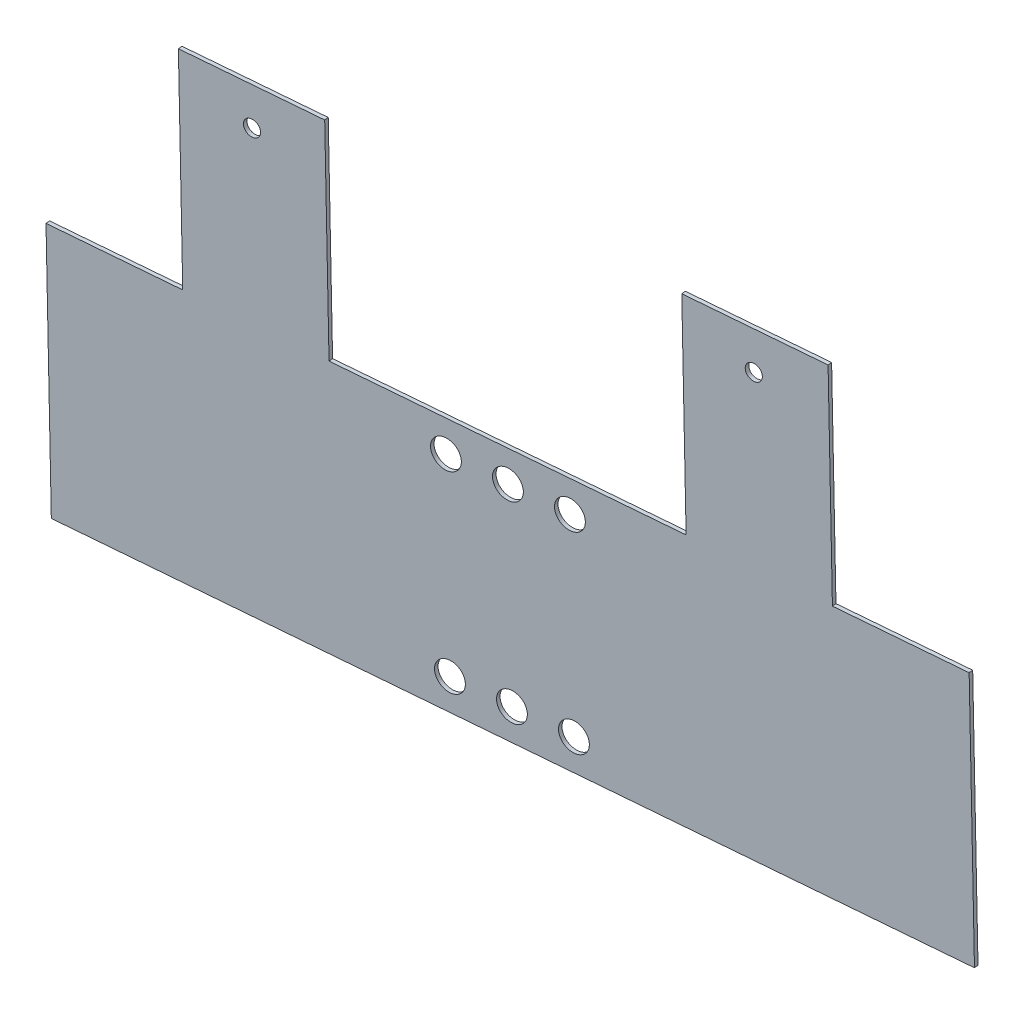
ISO-10303-21;
HEADER;
FILE_DESCRIPTION(('STEP AP214'),'2;1');
FILE_NAME('part.step','',(''),(''),'','','');
FILE_SCHEMA(('AUTOMOTIVE_DESIGN { 1 0 10303 214 1 1 1 1 }'));
ENDSEC;
DATA;
#1=APPLICATION_CONTEXT('core data for automotive mechanical design processes');
#2=APPLICATION_PROTOCOL_DEFINITION('international standard','automotive_design',2000,#1);
#3=PRODUCT_CONTEXT('',#1,'mechanical');
#4=PRODUCT('Part','Part','',(#3));
#5=PRODUCT_RELATED_PRODUCT_CATEGORY('part','',(#4));
#6=PRODUCT_DEFINITION_FORMATION('','',#4);
#7=PRODUCT_DEFINITION_CONTEXT('part definition',#1,'design');
#8=PRODUCT_DEFINITION('design','',#6,#7);
#9=PRODUCT_DEFINITION_SHAPE('','',#8);
#10=(LENGTH_UNIT() NAMED_UNIT(*) SI_UNIT(.MILLI.,.METRE.));
#11=(NAMED_UNIT(*) PLANE_ANGLE_UNIT() SI_UNIT($,.RADIAN.));
#12=(NAMED_UNIT(*) SI_UNIT($,.STERADIAN.) SOLID_ANGLE_UNIT());
#13=UNCERTAINTY_MEASURE_WITH_UNIT(LENGTH_MEASURE(1.E-05),#10,'distance_accuracy_value','');
#14=(GEOMETRIC_REPRESENTATION_CONTEXT(3) GLOBAL_UNCERTAINTY_ASSIGNED_CONTEXT((#13)) GLOBAL_UNIT_ASSIGNED_CONTEXT((#10,
#11,#12)) REPRESENTATION_CONTEXT('',''));
#15=CARTESIAN_POINT('',(0.,0.,0.));
#16=DIRECTION('',(0.,0.,1.));
#17=DIRECTION('',(1.,0.,0.));
#18=AXIS2_PLACEMENT_3D('',#15,#16,#17);
#19=CARTESIAN_POINT('',(-501.489956429642,-328.947406139133,240.499575413323));
#20=DIRECTION('',(0.99656940991837,0.00195950965151666,-0.0827379691367708));
#21=DIRECTION('',(-0.0827381279808112,0.,-0.996571323176736));
#22=AXIS2_PLACEMENT_3D('',#19,#20,#21);
#23=PLANE('',#22);
#24=DIRECTION('',(-0.00028055772663787,0.999793911631424,0.0202991515117986));
#25=VECTOR('',#24,1.);
#26=CARTESIAN_POINT('',(-501.439505510465,-328.959723900019,241.106959260261));
#27=LINE('',#26,#25);
#28=CARTESIAN_POINT('',(-501.439505510465,-328.959723900019,241.106959260261));
#29=VERTEX_POINT('',#28);
#30=CARTESIAN_POINT('',(-501.450907376476,-288.328099331318,241.9319167777));
#31=VERTEX_POINT('',#30);
#32=EDGE_CURVE('E157',#29,#31,#27,.T.);
#33=ORIENTED_EDGE('',*,*,#32,.T.);
#34=DIRECTION('',(0.082760694186997,-0.0202063006674291,0.99636457831008));
#35=VECTOR('',#34,1.);
#36=CARTESIAN_POINT('',(-501.501358295652,-288.315781570432,241.324532930762));
#37=LINE('',#36,#35);
#38=CARTESIAN_POINT('',(-501.501358295652,-288.315781570432,241.324532930762));
#39=VERTEX_POINT('',#38);
#40=EDGE_CURVE('E11',#39,#31,#37,.T.);
#41=ORIENTED_EDGE('',*,*,#40,.F.);
#42=DIRECTION('',(-0.00028055772663787,0.999793911631424,0.0202991515117986));
#43=VECTOR('',#42,1.);
#44=CARTESIAN_POINT('',(-501.489956429642,-328.947406139133,240.499575413323));
#45=LINE('',#44,#43);
#46=CARTESIAN_POINT('',(-501.489956429642,-328.947406139133,240.499575413323));
#47=VERTEX_POINT('',#46);
#48=EDGE_CURVE('E181',#47,#39,#45,.T.);
#49=ORIENTED_EDGE('',*,*,#48,.F.);
#50=DIRECTION('',(0.082760694186997,-0.0202063006674291,0.99636457831008));
#51=VECTOR('',#50,1.);
#52=CARTESIAN_POINT('',(-501.489956429642,-328.947406139133,240.499575413323));
#53=LINE('',#52,#51);
#54=EDGE_CURVE('E153',#47,#29,#53,.T.);
#55=ORIENTED_EDGE('',*,*,#54,.T.);
#56=EDGE_LOOP('',(#33,#41,#49,#55));
#57=FACE_BOUND('',#56,.T.);
#58=ADVANCED_FACE('F36',(#57),#23,.F.);
#59=CARTESIAN_POINT('',(-501.501358295652,-288.315781570432,241.324532930762));
#60=DIRECTION('',(0.000280557726639362,-0.999793911631424,-0.0202991515117987));
#61=DIRECTION('',(0.,0.0202991523106987,-0.999793950979634));
#62=AXIS2_PLACEMENT_3D('',#59,#60,#61);
#63=PLANE('',#62);
#64=DIRECTION('',(0.99656940991837,0.00195950965151815,-0.0827379691367705));
#65=VECTOR('',#64,1.);
#66=CARTESIAN_POINT('',(-501.450907376476,-288.328099331318,241.9319167777));
#67=LINE('',#66,#65);
#68=CARTESIAN_POINT('',(-481.580309912113,-288.289028668377,240.282204411082));
#69=VERTEX_POINT('',#68);
#70=EDGE_CURVE('E160',#31,#69,#67,.T.);
#71=ORIENTED_EDGE('',*,*,#70,.T.);
#72=DIRECTION('',(0.082760694186997,-0.0202063006674291,0.99636457831008));
#73=VECTOR('',#72,1.);
#74=CARTESIAN_POINT('',(-481.63076083129,-288.27671090749,239.674820564144));
#75=LINE('',#74,#73);
#76=CARTESIAN_POINT('',(-481.63076083129,-288.27671090749,239.674820564144));
#77=VERTEX_POINT('',#76);
#78=EDGE_CURVE('E44',#77,#69,#75,.T.);
#79=ORIENTED_EDGE('',*,*,#78,.F.);
#80=DIRECTION('',(0.99656940991837,0.00195950965151815,-0.0827379691367705));
#81=VECTOR('',#80,1.);
#82=CARTESIAN_POINT('',(-501.501358295652,-288.315781570432,241.324532930762));
#83=LINE('',#82,#81);
#84=EDGE_CURVE('E105',#39,#77,#83,.T.);
#85=ORIENTED_EDGE('',*,*,#84,.F.);
#86=ORIENTED_EDGE('',*,*,#40,.T.);
#87=EDGE_LOOP('',(#71,#79,#85,#86));
#88=FACE_BOUND('',#87,.T.);
#89=ADVANCED_FACE('F332',(#88),#63,.F.);
#90=CARTESIAN_POINT('',(-481.63076083129,-288.27671090749,239.674820564144));
#91=DIRECTION('',(0.99656940991837,0.00195950965151761,-0.0827379691367708));
#92=DIRECTION('',(-0.0827381279808112,0.,-0.996571323176736));
#93=AXIS2_PLACEMENT_3D('',#90,#91,#92);
#94=PLANE('',#93);
#95=DIRECTION('',(-0.000280557726638828,0.999793911631424,0.0202991515117985));
#96=VECTOR('',#95,1.);
#97=CARTESIAN_POINT('',(-481.580309912113,-288.289028668377,240.282204411082));
#98=LINE('',#97,#96);
#99=CARTESIAN_POINT('',(-481.589628158372,-255.082579541952,240.956406098194));
#100=VERTEX_POINT('',#99);
#101=EDGE_CURVE('E163',#69,#100,#98,.T.);
#102=ORIENTED_EDGE('',*,*,#101,.T.);
#103=DIRECTION('',(0.082760694186997,-0.0202063006674291,0.99636457831008));
#104=VECTOR('',#103,1.);
#105=CARTESIAN_POINT('',(-481.640079077549,-255.070261781065,240.349022251256));
#106=LINE('',#105,#104);
#107=CARTESIAN_POINT('',(-481.640079077549,-255.070261781065,240.349022251256));
#108=VERTEX_POINT('',#107);
#109=EDGE_CURVE('E200',#108,#100,#106,.T.);
#110=ORIENTED_EDGE('',*,*,#109,.F.);
#111=DIRECTION('',(-0.000280557726638828,0.999793911631424,0.0202991515117985));
#112=VECTOR('',#111,1.);
#113=CARTESIAN_POINT('',(-481.63076083129,-288.27671090749,239.674820564144));
#114=LINE('',#113,#112);
#115=EDGE_CURVE('E208',#77,#108,#114,.T.);
#116=ORIENTED_EDGE('',*,*,#115,.F.);
#117=ORIENTED_EDGE('',*,*,#78,.T.);
#118=EDGE_LOOP('',(#102,#110,#116,#117));
#119=FACE_BOUND('',#118,.T.);
#120=ADVANCED_FACE('F206',(#119),#94,.F.);
#121=CARTESIAN_POINT('',(-481.640079077549,-255.070261781065,240.349022251256));
#122=DIRECTION('',(0.000280557726637702,-0.999793911631424,-0.0202991515117986));
#123=DIRECTION('',(0.,0.0202991523106985,-0.999793950979634));
#124=AXIS2_PLACEMENT_3D('',#121,#122,#123);
#125=PLANE('',#124);
#126=DIRECTION('',(0.99656940991837,0.00195950965151649,-0.0827379691367709));
#127=VECTOR('',#126,1.);
#128=CARTESIAN_POINT('',(-481.589628158372,-255.082579541952,240.956406098194));
#129=LINE('',#128,#127);
#130=CARTESIAN_POINT('',(-460.326823228354,-255.040771444027,239.191108788692));
#131=VERTEX_POINT('',#130);
#132=EDGE_CURVE('E165',#100,#131,#129,.T.);
#133=ORIENTED_EDGE('',*,*,#132,.T.);
#134=DIRECTION('',(0.082760694186997,-0.0202063006674291,0.99636457831008));
#135=VECTOR('',#134,1.);
#136=CARTESIAN_POINT('',(-460.37727414753,-255.028453683141,238.583724941754));
#137=LINE('',#136,#135);
#138=CARTESIAN_POINT('',(-460.37727414753,-255.028453683141,238.583724941754));
#139=VERTEX_POINT('',#138);
#140=EDGE_CURVE('E197',#139,#131,#137,.T.);
#141=ORIENTED_EDGE('',*,*,#140,.F.);
#142=DIRECTION('',(0.99656940991837,0.00195950965151649,-0.0827379691367709));
#143=VECTOR('',#142,1.);
#144=CARTESIAN_POINT('',(-481.640079077549,-255.070261781065,240.349022251256));
#145=LINE('',#144,#143);
#146=EDGE_CURVE('E224',#108,#139,#145,.T.);
#147=ORIENTED_EDGE('',*,*,#146,.F.);
#148=ORIENTED_EDGE('',*,*,#109,.T.);
#149=EDGE_LOOP('',(#133,#141,#147,#148));
#150=FACE_BOUND('',#149,.T.);
#151=ADVANCED_FACE('F215',(#150),#125,.F.);
#152=CARTESIAN_POINT('',(-460.367955901271,-288.234902809565,237.909523254642));
#153=DIRECTION('',(-0.99656940991837,-0.00195950965151761,0.0827379691367708));
#154=DIRECTION('',(0.0827381279808112,0.,0.996571323176736));
#155=AXIS2_PLACEMENT_3D('',#152,#153,#154);
#156=PLANE('',#155);
#157=DIRECTION('',(0.000280557726638828,-0.999793911631424,-0.0202991515117985));
#158=VECTOR('',#157,1.);
#159=CARTESIAN_POINT('',(-460.317504982095,-288.247220570452,238.51690710158));
#160=LINE('',#159,#158);
#161=CARTESIAN_POINT('',(-460.317504982095,-288.247220570452,238.51690710158));
#162=VERTEX_POINT('',#161);
#163=EDGE_CURVE('E167',#131,#162,#160,.T.);
#164=ORIENTED_EDGE('',*,*,#163,.T.);
#165=DIRECTION('',(0.082760694186997,-0.0202063006674291,0.99636457831008));
#166=VECTOR('',#165,1.);
#167=CARTESIAN_POINT('',(-460.367955901271,-288.234902809565,237.909523254642));
#168=LINE('',#167,#166);
#169=CARTESIAN_POINT('',(-460.367955901271,-288.234902809565,237.909523254642));
#170=VERTEX_POINT('',#169);
#171=EDGE_CURVE('E194',#170,#162,#168,.T.);
#172=ORIENTED_EDGE('',*,*,#171,.F.);
#173=DIRECTION('',(0.000280557726638828,-0.999793911631424,-0.0202991515117985));
#174=VECTOR('',#173,1.);
#175=CARTESIAN_POINT('',(-460.367955901271,-288.234902809565,237.909523254642));
#176=LINE('',#175,#174);
#177=EDGE_CURVE('E221',#139,#170,#176,.T.);
#178=ORIENTED_EDGE('',*,*,#177,.F.);
#179=ORIENTED_EDGE('',*,*,#140,.T.);
#180=EDGE_LOOP('',(#164,#172,#178,#179));
#181=FACE_BOUND('',#180,.T.);
#182=ADVANCED_FACE('F219',(#181),#156,.F.);
#183=CARTESIAN_POINT('',(-460.367955901271,-288.234902809565,237.909523254642));
#184=DIRECTION('',(0.000280557726638659,-0.999793911631424,-0.0202991515117987));
#185=DIRECTION('',(0.,0.0202991523106986,-0.999793950979634));
#186=AXIS2_PLACEMENT_3D('',#183,#184,#185);
#187=PLANE('',#186);
#188=DIRECTION('',(0.99656940991837,0.00195950965151746,-0.0827379691367711));
#189=VECTOR('',#188,1.);
#190=CARTESIAN_POINT('',(-460.317504982095,-288.247220570452,238.51690710158));
#191=LINE('',#190,#189);
#192=CARTESIAN_POINT('',(-408.426135807645,-288.145188902897,234.208741048628));
#193=VERTEX_POINT('',#192);
#194=EDGE_CURVE('E169',#162,#193,#191,.T.);
#195=ORIENTED_EDGE('',*,*,#194,.T.);
#196=DIRECTION('',(0.082760694186997,-0.0202063006674291,0.99636457831008));
#197=VECTOR('',#196,1.);
#198=CARTESIAN_POINT('',(-408.476586726822,-288.132871142011,233.60135720169));
#199=LINE('',#198,#197);
#200=CARTESIAN_POINT('',(-408.476586726822,-288.132871142011,233.60135720169));
#201=VERTEX_POINT('',#200);
#202=EDGE_CURVE('E191',#201,#193,#199,.T.);
#203=ORIENTED_EDGE('',*,*,#202,.F.);
#204=DIRECTION('',(0.99656940991837,0.00195950965151746,-0.0827379691367711));
#205=VECTOR('',#204,1.);
#206=CARTESIAN_POINT('',(-460.367955901271,-288.234902809565,237.909523254642));
#207=LINE('',#206,#205);
#208=EDGE_CURVE('E223',#170,#201,#207,.T.);
#209=ORIENTED_EDGE('',*,*,#208,.F.);
#210=ORIENTED_EDGE('',*,*,#171,.T.);
#211=EDGE_LOOP('',(#195,#203,#209,#210));
#212=FACE_BOUND('',#211,.T.);
#213=ADVANCED_FACE('F345',(#212),#187,.F.);
#214=CARTESIAN_POINT('',(-408.476586726822,-288.132871142011,233.60135720169));
#215=DIRECTION('',(0.99656940991837,0.00195950965151767,-0.0827379691367708));
#216=DIRECTION('',(-0.0827381279808112,0.,-0.996571323176736));
#217=AXIS2_PLACEMENT_3D('',#214,#215,#216);
#218=PLANE('',#217);
#219=DIRECTION('',(-0.000280557726638828,0.999793911631424,0.0202991515117993));
#220=VECTOR('',#219,1.);
#221=CARTESIAN_POINT('',(-408.426135807645,-288.145188902897,234.208741048628));
#222=LINE('',#221,#220);
#223=CARTESIAN_POINT('',(-408.435454053904,-254.938739776473,234.88294273574));
#224=VERTEX_POINT('',#223);
#225=EDGE_CURVE('E171',#193,#224,#222,.T.);
#226=ORIENTED_EDGE('',*,*,#225,.T.);
#227=DIRECTION('',(0.082760694186997,-0.0202063006674291,0.99636457831008));
#228=VECTOR('',#227,1.);
#229=CARTESIAN_POINT('',(-408.485904973081,-254.926422015586,234.275558888802));
#230=LINE('',#229,#228);
#231=CARTESIAN_POINT('',(-408.485904973081,-254.926422015586,234.275558888802));
#232=VERTEX_POINT('',#231);
#233=EDGE_CURVE('E188',#232,#224,#230,.T.);
#234=ORIENTED_EDGE('',*,*,#233,.F.);
#235=DIRECTION('',(-0.000280557726638828,0.999793911631424,0.0202991515117993));
#236=VECTOR('',#235,1.);
#237=CARTESIAN_POINT('',(-408.476586726822,-288.132871142011,233.60135720169));
#238=LINE('',#237,#236);
#239=EDGE_CURVE('E226',#201,#232,#238,.T.);
#240=ORIENTED_EDGE('',*,*,#239,.F.);
#241=ORIENTED_EDGE('',*,*,#202,.T.);
#242=EDGE_LOOP('',(#226,#234,#240,#241));
#243=FACE_BOUND('',#242,.T.);
#244=ADVANCED_FACE('F348',(#243),#218,.F.);
#245=CARTESIAN_POINT('',(-408.485904973081,-254.926422015586,234.275558888802));
#246=DIRECTION('',(0.000280557726637702,-0.999793911631424,-0.0202991515117986));
#247=DIRECTION('',(0.,0.0202991523106985,-0.999793950979634));
#248=AXIS2_PLACEMENT_3D('',#245,#246,#247);
#249=PLANE('',#248);
#250=DIRECTION('',(0.99656940991837,0.00195950965151649,-0.0827379691367709));
#251=VECTOR('',#250,1.);
#252=CARTESIAN_POINT('',(-408.435454053904,-254.938739776473,234.88294273574));
#253=LINE('',#252,#251);
#254=CARTESIAN_POINT('',(-387.172649123886,-254.896931678548,233.117645426238));
#255=VERTEX_POINT('',#254);
#256=EDGE_CURVE('E173',#224,#255,#253,.T.);
#257=ORIENTED_EDGE('',*,*,#256,.T.);
#258=DIRECTION('',(0.082760694186997,-0.0202063006674291,0.99636457831008));
#259=VECTOR('',#258,1.);
#260=CARTESIAN_POINT('',(-387.223100043062,-254.884613917661,232.5102615793));
#261=LINE('',#260,#259);
#262=CARTESIAN_POINT('',(-387.223100043062,-254.884613917661,232.5102615793));
#263=VERTEX_POINT('',#262);
#264=EDGE_CURVE('E185',#263,#255,#261,.T.);
#265=ORIENTED_EDGE('',*,*,#264,.F.);
#266=DIRECTION('',(0.99656940991837,0.00195950965151649,-0.0827379691367709));
#267=VECTOR('',#266,1.);
#268=CARTESIAN_POINT('',(-408.485904973081,-254.926422015586,234.275558888802));
#269=LINE('',#268,#267);
#270=EDGE_CURVE('E232',#232,#263,#269,.T.);
#271=ORIENTED_EDGE('',*,*,#270,.F.);
#272=ORIENTED_EDGE('',*,*,#233,.T.);
#273=EDGE_LOOP('',(#257,#265,#271,#272));
#274=FACE_BOUND('',#273,.T.);
#275=ADVANCED_FACE('F238',(#274),#249,.F.);
#276=CARTESIAN_POINT('',(-387.213781796803,-288.091063044086,231.836059892188));
#277=DIRECTION('',(-0.99656940991837,-0.00195950965151761,0.0827379691367708));
#278=DIRECTION('',(0.0827381279808112,0.,0.996571323176736));
#279=AXIS2_PLACEMENT_3D('',#276,#277,#278);
#280=PLANE('',#279);
#281=DIRECTION('',(0.000280557726638828,-0.999793911631424,-0.0202991515117985));
#282=VECTOR('',#281,1.);
#283=CARTESIAN_POINT('',(-387.163330877627,-288.103380804973,232.443443739126));
#284=LINE('',#283,#282);
#285=CARTESIAN_POINT('',(-387.163330877627,-288.103380804973,232.443443739126));
#286=VERTEX_POINT('',#285);
#287=EDGE_CURVE('E175',#255,#286,#284,.T.);
#288=ORIENTED_EDGE('',*,*,#287,.T.);
#289=DIRECTION('',(0.082760694186997,-0.0202063006674291,0.99636457831008));
#290=VECTOR('',#289,1.);
#291=CARTESIAN_POINT('',(-387.213781796803,-288.091063044086,231.836059892188));
#292=LINE('',#291,#290);
#293=CARTESIAN_POINT('',(-387.213781796803,-288.091063044086,231.836059892188));
#294=VERTEX_POINT('',#293);
#295=EDGE_CURVE('E148',#294,#286,#292,.T.);
#296=ORIENTED_EDGE('',*,*,#295,.F.);
#297=DIRECTION('',(0.000280557726638828,-0.999793911631424,-0.0202991515117985));
#298=VECTOR('',#297,1.);
#299=CARTESIAN_POINT('',(-387.213781796803,-288.091063044086,231.836059892188));
#300=LINE('',#299,#298);
#301=EDGE_CURVE('E137',#263,#294,#300,.T.);
#302=ORIENTED_EDGE('',*,*,#301,.F.);
#303=ORIENTED_EDGE('',*,*,#264,.T.);
#304=EDGE_LOOP('',(#288,#296,#302,#303));
#305=FACE_BOUND('',#304,.T.);
#306=ADVANCED_FACE('F242',(#305),#280,.F.);
#307=CARTESIAN_POINT('',(-387.213781796803,-288.091063044086,231.836059892188));
#308=DIRECTION('',(0.000280557726639362,-0.999793911631424,-0.0202991515117987));
#309=DIRECTION('',(0.,0.0202991523106987,-0.999793950979634));
#310=AXIS2_PLACEMENT_3D('',#307,#308,#309);
#311=PLANE('',#310);
#312=DIRECTION('',(0.99656940991837,0.00195950965151815,-0.0827379691367705));
#313=VECTOR('',#312,1.);
#314=CARTESIAN_POINT('',(-387.163330877627,-288.103380804973,232.443443739126));
#315=LINE('',#314,#313);
#316=CARTESIAN_POINT('',(-367.292733413265,-288.064310142031,230.793731372508));
#317=VERTEX_POINT('',#316);
#318=EDGE_CURVE('E146',#286,#317,#315,.T.);
#319=ORIENTED_EDGE('',*,*,#318,.T.);
#320=DIRECTION('',(0.082760694186997,-0.0202063006674291,0.99636457831008));
#321=VECTOR('',#320,1.);
#322=CARTESIAN_POINT('',(-367.343184332441,-288.051992381144,230.18634752557));
#323=LINE('',#322,#321);
#324=CARTESIAN_POINT('',(-367.343184332441,-288.051992381144,230.18634752557));
#325=VERTEX_POINT('',#324);
#326=EDGE_CURVE('E143',#325,#317,#323,.T.);
#327=ORIENTED_EDGE('',*,*,#326,.F.);
#328=DIRECTION('',(0.99656940991837,0.00195950965151815,-0.0827379691367705));
#329=VECTOR('',#328,1.);
#330=CARTESIAN_POINT('',(-387.213781796803,-288.091063044086,231.836059892188));
#331=LINE('',#330,#329);
#332=EDGE_CURVE('E130',#294,#325,#331,.T.);
#333=ORIENTED_EDGE('',*,*,#332,.F.);
#334=ORIENTED_EDGE('',*,*,#295,.T.);
#335=EDGE_LOOP('',(#319,#327,#333,#334));
#336=FACE_BOUND('',#335,.T.);
#337=ADVANCED_FACE('F144',(#336),#311,.F.);
#338=CARTESIAN_POINT('',(-367.331782466431,-328.683616949845,229.361390008131));
#339=DIRECTION('',(-0.99656940991837,-0.00195950965151394,0.0827379691367708));
#340=DIRECTION('',(0.0827381279808113,0.,0.996571323176736));
#341=AXIS2_PLACEMENT_3D('',#338,#339,#340);
#342=PLANE('',#341);
#343=DIRECTION('',(0.000280557726635138,-0.999793911631424,-0.0202991515117986));
#344=VECTOR('',#343,1.);
#345=CARTESIAN_POINT('',(-367.281331547254,-328.695934710732,229.968773855068));
#346=LINE('',#345,#344);
#347=CARTESIAN_POINT('',(-367.281331547254,-328.695934710732,229.968773855068));
#348=VERTEX_POINT('',#347);
#349=EDGE_CURVE('E178',#317,#348,#346,.T.);
#350=ORIENTED_EDGE('',*,*,#349,.T.);
#351=DIRECTION('',(0.082760694186997,-0.0202063006674291,0.99636457831008));
#352=VECTOR('',#351,1.);
#353=CARTESIAN_POINT('',(-367.331782466431,-328.683616949845,229.361390008131));
#354=LINE('',#353,#352);
#355=CARTESIAN_POINT('',(-367.331782466431,-328.683616949845,229.361390008131));
#356=VERTEX_POINT('',#355);
#357=EDGE_CURVE('E149',#356,#348,#354,.T.);
#358=ORIENTED_EDGE('',*,*,#357,.F.);
#359=DIRECTION('',(0.000280557726635138,-0.999793911631424,-0.0202991515117986));
#360=VECTOR('',#359,1.);
#361=CARTESIAN_POINT('',(-367.331782466431,-328.683616949845,229.361390008131));
#362=LINE('',#361,#360);
#363=EDGE_CURVE('E134',#325,#356,#362,.T.);
#364=ORIENTED_EDGE('',*,*,#363,.F.);
#365=ORIENTED_EDGE('',*,*,#326,.T.);
#366=EDGE_LOOP('',(#350,#358,#364,#365));
#367=FACE_BOUND('',#366,.T.);
#368=ADVANCED_FACE('F151',(#367),#342,.F.);
#369=CARTESIAN_POINT('',(-501.489956429642,-328.947406139133,240.499575413323));
#370=DIRECTION('',(-0.000280557726639362,0.999793911631424,0.0202991515117987));
#371=DIRECTION('',(0.,-0.0202991523106987,0.999793950979634));
#372=AXIS2_PLACEMENT_3D('',#369,#370,#371);
#373=PLANE('',#372);
#374=DIRECTION('',(-0.99656940991837,-0.00195950965151815,0.0827379691367705));
#375=VECTOR('',#374,1.);
#376=CARTESIAN_POINT('',(-501.439505510465,-328.959723900019,241.106959260261));
#377=LINE('',#376,#375);
#378=EDGE_CURVE('E93',#348,#29,#377,.T.);
#379=ORIENTED_EDGE('',*,*,#378,.T.);
#380=ORIENTED_EDGE('',*,*,#54,.F.);
#381=DIRECTION('',(-0.99656940991837,-0.00195950965151794,0.0827379691367709));
#382=VECTOR('',#381,1.);
#383=CARTESIAN_POINT('',(-386.587283527019,-328.721478176367,230.960035357474));
#384=LINE('',#383,#382);
#385=EDGE_CURVE('E52',#356,#47,#384,.T.);
#386=ORIENTED_EDGE('',*,*,#385,.F.);
#387=ORIENTED_EDGE('',*,*,#357,.T.);
#388=EDGE_LOOP('',(#379,#380,#386,#387));
#389=FACE_BOUND('',#388,.T.);
#390=ADVANCED_FACE('F243',(#389),#373,.F.);
#391=CARTESIAN_POINT('',(16.9467758676456,-4.13761208613666,204.023991786853));
#392=DIRECTION('',(-0.0827606941869968,0.0202063006674291,-0.99636457831008));
#393=DIRECTION('',(-0.996568045750024,0.,0.0827775947341869));
#394=AXIS2_PLACEMENT_3D('',#391,#392,#393);
#395=PLANE('',#394);
#396=CARTESIAN_POINT('',(-471.054813760999,-261.10108861582,239.347476604441));
#397=DIRECTION('',(-0.0827606941869969,0.0202063006674291,-0.99636457831008));
#398=DIRECTION('',(-0.996568045750024,0.,0.0827775947341869));
#399=AXIS2_PLACEMENT_3D('',#396,#397,#398);
#400=CIRCLE('',#399,1.25000000000001);
#401=CARTESIAN_POINT('',(-472.300523818187,-261.10108861582,239.450948597859));
#402=VERTEX_POINT('',#401);
#403=EDGE_CURVE('E294',#402,#402,#400,.T.);
#404=ORIENTED_EDGE('',*,*,#403,.F.);
#405=EDGE_LOOP('',(#404));
#406=FACE_BOUND('',#405,.T.);
#407=CARTESIAN_POINT('',(-398.13117772993,-260.957702145591,233.293153155214));
#408=DIRECTION('',(-0.0827606941869968,0.0202063006674291,-0.99636457831008));
#409=DIRECTION('',(-0.996568045750024,0.,0.0827775947341869));
#410=AXIS2_PLACEMENT_3D('',#407,#408,#409);
#411=CIRCLE('',#410,1.24999999999994);
#412=CARTESIAN_POINT('',(-399.376887787118,-260.957702145591,233.396625148631));
#413=VERTEX_POINT('',#412);
#414=EDGE_CURVE('E288',#413,#413,#411,.T.);
#415=ORIENTED_EDGE('',*,*,#414,.F.);
#416=EDGE_LOOP('',(#415));
#417=FACE_BOUND('',#416,.T.);
#418=CARTESIAN_POINT('',(-443.473097110312,-293.200655525,236.40548570979));
#419=DIRECTION('',(0.0827606941869969,-0.0202063006674292,0.99636457831008));
#420=DIRECTION('',(-0.996566946014347,-0.00391901177606996,0.0826980257221201));
#421=AXIS2_PLACEMENT_3D('',#418,#419,#420);
#422=CIRCLE('',#421,2.24999999999997);
#423=CARTESIAN_POINT('',(-445.715372738845,-293.209473301496,236.591556267665));
#424=VERTEX_POINT('',#423);
#425=EDGE_CURVE('E279',#424,#424,#422,.T.);
#426=ORIENTED_EDGE('',*,*,#425,.T.);
#427=EDGE_LOOP('',(#426));
#428=FACE_BOUND('',#427,.T.);
#429=CARTESIAN_POINT('',(-434.464565062866,-293.182942453393,235.657572278879));
#430=DIRECTION('',(0.0827606941869969,-0.0202063006674292,0.99636457831008));
#431=DIRECTION('',(-0.996566946014347,-0.00391901177606996,0.0826980257221201));
#432=AXIS2_PLACEMENT_3D('',#429,#430,#431);
#433=CIRCLE('',#432,2.24999999999995);
#434=CARTESIAN_POINT('',(-436.706840691398,-293.191760229889,235.843642836754));
#435=VERTEX_POINT('',#434);
#436=EDGE_CURVE('E271',#435,#435,#433,.T.);
#437=ORIENTED_EDGE('',*,*,#436,.T.);
#438=EDGE_LOOP('',(#437));
#439=FACE_BOUND('',#438,.T.);
#440=CARTESIAN_POINT('',(-425.456033015419,-293.165229381785,234.909658847968));
#441=DIRECTION('',(0.0827606941869969,-0.0202063006674292,0.99636457831008));
#442=DIRECTION('',(-0.996566946014347,-0.00391901177606996,0.0826980257221201));
#443=AXIS2_PLACEMENT_3D('',#440,#441,#442);
#444=CIRCLE('',#443,2.24999999999995);
#445=CARTESIAN_POINT('',(-427.698308643951,-293.174047158281,235.095729405843));
#446=VERTEX_POINT('',#445);
#447=EDGE_CURVE('E272',#446,#446,#444,.T.);
#448=ORIENTED_EDGE('',*,*,#447,.T.);
#449=EDGE_LOOP('',(#448));
#450=FACE_BOUND('',#449,.T.);
#451=CARTESIAN_POINT('',(-443.464500821569,-323.834340975916,235.783519707498));
#452=DIRECTION('',(-0.0827606941869969,0.0202063006674291,-0.99636457831008));
#453=DIRECTION('',(-0.996568045750024,0.,0.0827775947341869));
#454=AXIS2_PLACEMENT_3D('',#451,#452,#453);
#455=CIRCLE('',#454,2.24999999999997);
#456=CARTESIAN_POINT('',(-445.706778924506,-323.834340975916,235.96976929565));
#457=VERTEX_POINT('',#456);
#458=EDGE_CURVE('E261',#457,#457,#455,.T.);
#459=ORIENTED_EDGE('',*,*,#458,.F.);
#460=EDGE_LOOP('',(#459));
#461=FACE_BOUND('',#460,.T.);
#462=CARTESIAN_POINT('',(-434.455968774122,-323.816627903961,235.035606276595));
#463=DIRECTION('',(-0.0827606941869969,0.0202063006674291,-0.99636457831008));
#464=DIRECTION('',(-0.996568045750024,0.,0.0827775947341869));
#465=AXIS2_PLACEMENT_3D('',#462,#463,#464);
#466=CIRCLE('',#465,2.24999999999995);
#467=CARTESIAN_POINT('',(-436.69824687706,-323.816627903961,235.221855864746));
#468=VERTEX_POINT('',#467);
#469=EDGE_CURVE('E253',#468,#468,#466,.T.);
#470=ORIENTED_EDGE('',*,*,#469,.F.);
#471=EDGE_LOOP('',(#470));
#472=FACE_BOUND('',#471,.T.);
#473=CARTESIAN_POINT('',(-425.447436726675,-323.798914832006,234.287692845691));
#474=DIRECTION('',(-0.0827606941869969,0.0202063006674291,-0.99636457831008));
#475=DIRECTION('',(-0.996568045750024,0.,0.0827775947341869));
#476=AXIS2_PLACEMENT_3D('',#473,#474,#475);
#477=CIRCLE('',#476,2.24999999999995);
#478=CARTESIAN_POINT('',(-427.689714829613,-323.798914832006,234.473942433843));
#479=VERTEX_POINT('',#478);
#480=EDGE_CURVE('E254',#479,#479,#477,.T.);
#481=ORIENTED_EDGE('',*,*,#480,.F.);
#482=EDGE_LOOP('',(#481));
#483=FACE_BOUND('',#482,.T.);
#484=ORIENTED_EDGE('',*,*,#48,.T.);
#485=ORIENTED_EDGE('',*,*,#84,.T.);
#486=ORIENTED_EDGE('',*,*,#115,.T.);
#487=ORIENTED_EDGE('',*,*,#146,.T.);
#488=ORIENTED_EDGE('',*,*,#177,.T.);
#489=ORIENTED_EDGE('',*,*,#208,.T.);
#490=ORIENTED_EDGE('',*,*,#239,.T.);
#491=ORIENTED_EDGE('',*,*,#270,.T.);
#492=ORIENTED_EDGE('',*,*,#301,.T.);
#493=ORIENTED_EDGE('',*,*,#332,.T.);
#494=ORIENTED_EDGE('',*,*,#363,.T.);
#495=ORIENTED_EDGE('',*,*,#385,.T.);
#496=EDGE_LOOP('',(#484,#485,#486,#487,#488,#489,#490,#491,#492,#493,#494,#495));
#497=FACE_BOUND('',#496,.T.);
#498=ADVANCED_FACE('F132',(#406,#417,#428,#439,#450,#461,#472,#483,#497),#395,.T.);
#499=CARTESIAN_POINT('',(16.997226786822,-4.14992984702352,204.631375633791));
#500=DIRECTION('',(-0.0827606941869968,0.0202063006674291,-0.99636457831008));
#501=DIRECTION('',(-0.996568045750024,0.,0.0827775947341869));
#502=AXIS2_PLACEMENT_3D('',#499,#500,#501);
#503=PLANE('',#502);
#504=CARTESIAN_POINT('',(-471.004362841823,-261.113406376707,239.954860451379));
#505=DIRECTION('',(-0.0827606941869968,0.0202063006674291,-0.99636457831008));
#506=DIRECTION('',(-0.996568045750024,0.,0.0827775947341869));
#507=AXIS2_PLACEMENT_3D('',#504,#505,#506);
#508=CIRCLE('',#507,1.25000000000001);
#509=CARTESIAN_POINT('',(-472.25007289901,-261.113406376707,240.058332444796));
#510=VERTEX_POINT('',#509);
#511=EDGE_CURVE('E291',#510,#510,#508,.F.);
#512=ORIENTED_EDGE('',*,*,#511,.F.);
#513=EDGE_LOOP('',(#512));
#514=FACE_BOUND('',#513,.T.);
#515=CARTESIAN_POINT('',(-398.080726810754,-260.970019906477,233.900537002151));
#516=DIRECTION('',(-0.0827606941869968,0.0202063006674291,-0.99636457831008));
#517=DIRECTION('',(-0.996568045750024,0.,0.0827775947341869));
#518=AXIS2_PLACEMENT_3D('',#515,#516,#517);
#519=CIRCLE('',#518,1.24999999999994);
#520=CARTESIAN_POINT('',(-399.326436867941,-260.970019906477,234.004008995569));
#521=VERTEX_POINT('',#520);
#522=EDGE_CURVE('E275',#521,#521,#519,.F.);
#523=ORIENTED_EDGE('',*,*,#522,.F.);
#524=EDGE_LOOP('',(#523));
#525=FACE_BOUND('',#524,.T.);
#526=CARTESIAN_POINT('',(-443.422646191136,-293.212973285887,237.012869556728));
#527=DIRECTION('',(-0.0827606941869968,0.0202063006674291,-0.99636457831008));
#528=DIRECTION('',(-0.996568045750024,0.,0.0827775947341869));
#529=AXIS2_PLACEMENT_3D('',#526,#527,#528);
#530=CIRCLE('',#529,2.24999999999997);
#531=CARTESIAN_POINT('',(-445.664924294074,-293.212973285887,237.19911914488));
#532=VERTEX_POINT('',#531);
#533=EDGE_CURVE('E257',#532,#532,#530,.T.);
#534=ORIENTED_EDGE('',*,*,#533,.T.);
#535=EDGE_LOOP('',(#534));
#536=FACE_BOUND('',#535,.T.);
#537=CARTESIAN_POINT('',(-434.414114143689,-293.19526021428,236.264956125817));
#538=DIRECTION('',(-0.0827606941869968,0.0202063006674291,-0.99636457831008));
#539=DIRECTION('',(-0.996568045750024,0.,0.0827775947341869));
#540=AXIS2_PLACEMENT_3D('',#537,#538,#539);
#541=CIRCLE('',#540,2.24999999999995);
#542=CARTESIAN_POINT('',(-436.656392246627,-293.19526021428,236.451205713969));
#543=VERTEX_POINT('',#542);
#544=EDGE_CURVE('E276',#543,#543,#541,.T.);
#545=ORIENTED_EDGE('',*,*,#544,.T.);
#546=EDGE_LOOP('',(#545));
#547=FACE_BOUND('',#546,.T.);
#548=CARTESIAN_POINT('',(-425.405582096243,-293.177547142672,235.517042694906));
#549=DIRECTION('',(-0.0827606941869968,0.0202063006674291,-0.99636457831008));
#550=DIRECTION('',(-0.996568045750024,0.,0.0827775947341869));
#551=AXIS2_PLACEMENT_3D('',#548,#549,#550);
#552=CIRCLE('',#551,2.24999999999995);
#553=CARTESIAN_POINT('',(-427.64786019918,-293.177547142672,235.703292283058));
#554=VERTEX_POINT('',#553);
#555=EDGE_CURVE('E268',#554,#554,#552,.T.);
#556=ORIENTED_EDGE('',*,*,#555,.T.);
#557=EDGE_LOOP('',(#556));
#558=FACE_BOUND('',#557,.T.);
#559=CARTESIAN_POINT('',(-443.414049902392,-323.846658736803,236.390903554436));
#560=DIRECTION('',(-0.0827606941869968,0.0202063006674291,-0.99636457831008));
#561=DIRECTION('',(-0.996568045750024,0.,0.0827775947341869));
#562=AXIS2_PLACEMENT_3D('',#559,#560,#561);
#563=CIRCLE('',#562,2.24999999999997);
#564=CARTESIAN_POINT('',(-445.65632800533,-323.846658736803,236.577153142588));
#565=VERTEX_POINT('',#564);
#566=EDGE_CURVE('E161',#565,#565,#563,.F.);
#567=ORIENTED_EDGE('',*,*,#566,.F.);
#568=EDGE_LOOP('',(#567));
#569=FACE_BOUND('',#568,.T.);
#570=CARTESIAN_POINT('',(-434.405517854946,-323.828945664848,235.642990123532));
#571=DIRECTION('',(-0.0827606941869968,0.0202063006674291,-0.99636457831008));
#572=DIRECTION('',(-0.996568045750024,0.,0.0827775947341869));
#573=AXIS2_PLACEMENT_3D('',#570,#571,#572);
#574=CIRCLE('',#573,2.24999999999995);
#575=CARTESIAN_POINT('',(-436.647795957883,-323.828945664848,235.829239711684));
#576=VERTEX_POINT('',#575);
#577=EDGE_CURVE('E258',#576,#576,#574,.F.);
#578=ORIENTED_EDGE('',*,*,#577,.F.);
#579=EDGE_LOOP('',(#578));
#580=FACE_BOUND('',#579,.T.);
#581=CARTESIAN_POINT('',(-425.396985807499,-323.811232592893,234.895076692629));
#582=DIRECTION('',(-0.0827606941869968,0.0202063006674291,-0.99636457831008));
#583=DIRECTION('',(-0.996568045750024,0.,0.0827775947341869));
#584=AXIS2_PLACEMENT_3D('',#581,#582,#583);
#585=CIRCLE('',#584,2.24999999999995);
#586=CARTESIAN_POINT('',(-427.639263910437,-323.811232592893,235.08132628078));
#587=VERTEX_POINT('',#586);
#588=EDGE_CURVE('E250',#587,#587,#585,.F.);
#589=ORIENTED_EDGE('',*,*,#588,.F.);
#590=EDGE_LOOP('',(#589));
#591=FACE_BOUND('',#590,.T.);
#592=ORIENTED_EDGE('',*,*,#32,.F.);
#593=ORIENTED_EDGE('',*,*,#378,.F.);
#594=ORIENTED_EDGE('',*,*,#349,.F.);
#595=ORIENTED_EDGE('',*,*,#318,.F.);
#596=ORIENTED_EDGE('',*,*,#287,.F.);
#597=ORIENTED_EDGE('',*,*,#256,.F.);
#598=ORIENTED_EDGE('',*,*,#225,.F.);
#599=ORIENTED_EDGE('',*,*,#194,.F.);
#600=ORIENTED_EDGE('',*,*,#163,.F.);
#601=ORIENTED_EDGE('',*,*,#132,.F.);
#602=ORIENTED_EDGE('',*,*,#101,.F.);
#603=ORIENTED_EDGE('',*,*,#70,.F.);
#604=EDGE_LOOP('',(#592,#593,#594,#595,#596,#597,#598,#599,#600,#601,#602,#603));
#605=FACE_BOUND('',#604,.T.);
#606=ADVANCED_FACE('F210',(#514,#525,#536,#547,#558,#569,#580,#591,#605),#503,.F.);
#607=CARTESIAN_POINT('',(-424.870299974821,-323.939824702915,241.235902041343));
#608=DIRECTION('',(-0.0827606941869969,0.0202063006674291,-0.99636457831008));
#609=DIRECTION('',(-0.996568045750024,0.,0.0827775947341869));
#610=AXIS2_PLACEMENT_3D('',#607,#608,#609);
#611=CYLINDRICAL_SURFACE('',#610,2.24999999999995);
#612=ORIENTED_EDGE('',*,*,#588,.T.);
#613=EDGE_LOOP('',(#612));
#614=FACE_BOUND('',#613,.T.);
#615=ORIENTED_EDGE('',*,*,#480,.T.);
#616=EDGE_LOOP('',(#615));
#617=FACE_BOUND('',#616,.T.);
#618=ADVANCED_FACE('F317',(#614,#617),#611,.F.);
#619=CARTESIAN_POINT('',(-433.878832022268,-323.95753777487,241.983815472246));
#620=DIRECTION('',(-0.0827606941869969,0.0202063006674291,-0.99636457831008));
#621=DIRECTION('',(-0.996568045750024,0.,0.0827775947341869));
#622=AXIS2_PLACEMENT_3D('',#619,#620,#621);
#623=CYLINDRICAL_SURFACE('',#622,2.24999999999995);
#624=ORIENTED_EDGE('',*,*,#577,.T.);
#625=EDGE_LOOP('',(#624));
#626=FACE_BOUND('',#625,.T.);
#627=ORIENTED_EDGE('',*,*,#469,.T.);
#628=EDGE_LOOP('',(#627));
#629=FACE_BOUND('',#628,.T.);
#630=ADVANCED_FACE('F319',(#626,#629),#623,.F.);
#631=CARTESIAN_POINT('',(-442.887364069714,-323.975250846825,242.73172890315));
#632=DIRECTION('',(-0.0827606941869969,0.0202063006674291,-0.99636457831008));
#633=DIRECTION('',(-0.996568045750024,0.,0.0827775947341869));
#634=AXIS2_PLACEMENT_3D('',#631,#632,#633);
#635=CYLINDRICAL_SURFACE('',#634,2.24999999999997);
#636=ORIENTED_EDGE('',*,*,#566,.T.);
#637=EDGE_LOOP('',(#636));
#638=FACE_BOUND('',#637,.T.);
#639=ORIENTED_EDGE('',*,*,#458,.T.);
#640=EDGE_LOOP('',(#639));
#641=FACE_BOUND('',#640,.T.);
#642=ADVANCED_FACE('F326',(#638,#641),#635,.F.);
#643=CARTESIAN_POINT('',(-424.878896263565,-293.306139252693,241.85786804362));
#644=DIRECTION('',(-0.0827606941869969,0.0202063006674292,-0.99636457831008));
#645=DIRECTION('',(-0.996568045750024,0.,0.0827775947341869));
#646=AXIS2_PLACEMENT_3D('',#643,#644,#645);
#647=CYLINDRICAL_SURFACE('',#646,2.24999999999995);
#648=ORIENTED_EDGE('',*,*,#555,.F.);
#649=EDGE_LOOP('',(#648));
#650=FACE_BOUND('',#649,.T.);
#651=ORIENTED_EDGE('',*,*,#447,.F.);
#652=EDGE_LOOP('',(#651));
#653=FACE_BOUND('',#652,.T.);
#654=ADVANCED_FACE('F409',(#650,#653),#647,.F.);
#655=CARTESIAN_POINT('',(-433.887428311011,-293.323852324301,242.605781474531));
#656=DIRECTION('',(-0.0827606941869969,0.0202063006674292,-0.99636457831008));
#657=DIRECTION('',(-0.996568045750024,0.,0.0827775947341869));
#658=AXIS2_PLACEMENT_3D('',#655,#656,#657);
#659=CYLINDRICAL_SURFACE('',#658,2.24999999999995);
#660=ORIENTED_EDGE('',*,*,#544,.F.);
#661=EDGE_LOOP('',(#660));
#662=FACE_BOUND('',#661,.T.);
#663=ORIENTED_EDGE('',*,*,#436,.F.);
#664=EDGE_LOOP('',(#663));
#665=FACE_BOUND('',#664,.T.);
#666=ADVANCED_FACE('F401',(#662,#665),#659,.F.);
#667=CARTESIAN_POINT('',(-442.895960358458,-293.341565395909,243.353694905442));
#668=DIRECTION('',(-0.0827606941869969,0.0202063006674292,-0.99636457831008));
#669=DIRECTION('',(-0.996568045750024,0.,0.0827775947341869));
#670=AXIS2_PLACEMENT_3D('',#667,#668,#669);
#671=CYLINDRICAL_SURFACE('',#670,2.24999999999997);
#672=ORIENTED_EDGE('',*,*,#533,.F.);
#673=EDGE_LOOP('',(#672));
#674=FACE_BOUND('',#673,.T.);
#675=ORIENTED_EDGE('',*,*,#425,.F.);
#676=EDGE_LOOP('',(#675));
#677=FACE_BOUND('',#676,.T.);
#678=ADVANCED_FACE('F394',(#674,#677),#671,.F.);
#679=CARTESIAN_POINT('',(-397.788123570377,-261.041459967601,237.423217751437));
#680=DIRECTION('',(-0.0827606941869968,0.0202063006674291,-0.99636457831008));
#681=DIRECTION('',(-0.996568045750024,0.,0.0827775947341869));
#682=AXIS2_PLACEMENT_3D('',#679,#680,#681);
#683=CYLINDRICAL_SURFACE('',#682,1.24999999999994);
#684=ORIENTED_EDGE('',*,*,#522,.T.);
#685=EDGE_LOOP('',(#684));
#686=FACE_BOUND('',#685,.T.);
#687=ORIENTED_EDGE('',*,*,#414,.T.);
#688=EDGE_LOOP('',(#687));
#689=FACE_BOUND('',#688,.T.);
#690=ADVANCED_FACE('F384',(#686,#689),#683,.F.);
#691=CARTESIAN_POINT('',(-470.711759601446,-261.18484643783,243.477541200664));
#692=DIRECTION('',(-0.0827606941869969,0.0202063006674291,-0.99636457831008));
#693=DIRECTION('',(-0.996568045750024,0.,0.0827775947341869));
#694=AXIS2_PLACEMENT_3D('',#691,#692,#693);
#695=CYLINDRICAL_SURFACE('',#694,1.25000000000001);
#696=ORIENTED_EDGE('',*,*,#511,.T.);
#697=EDGE_LOOP('',(#696));
#698=FACE_BOUND('',#697,.T.);
#699=ORIENTED_EDGE('',*,*,#403,.T.);
#700=EDGE_LOOP('',(#699));
#701=FACE_BOUND('',#700,.T.);
#702=ADVANCED_FACE('F298',(#698,#701),#695,.F.);
#703=CLOSED_SHELL('',(#58,#89,#120,#151,#182,#213,#244,#275,#306,#337,#368,#390,#498,#606,#618,
#630,#642,#654,#666,#678,#690,#702));
#704=MANIFOLD_SOLID_BREP('B2',#703);
#705=ADVANCED_BREP_SHAPE_REPRESENTATION('',(#18,#704),#14);
#706=SHAPE_DEFINITION_REPRESENTATION(#9,#705);
ENDSEC;
END-ISO-10303-21;
